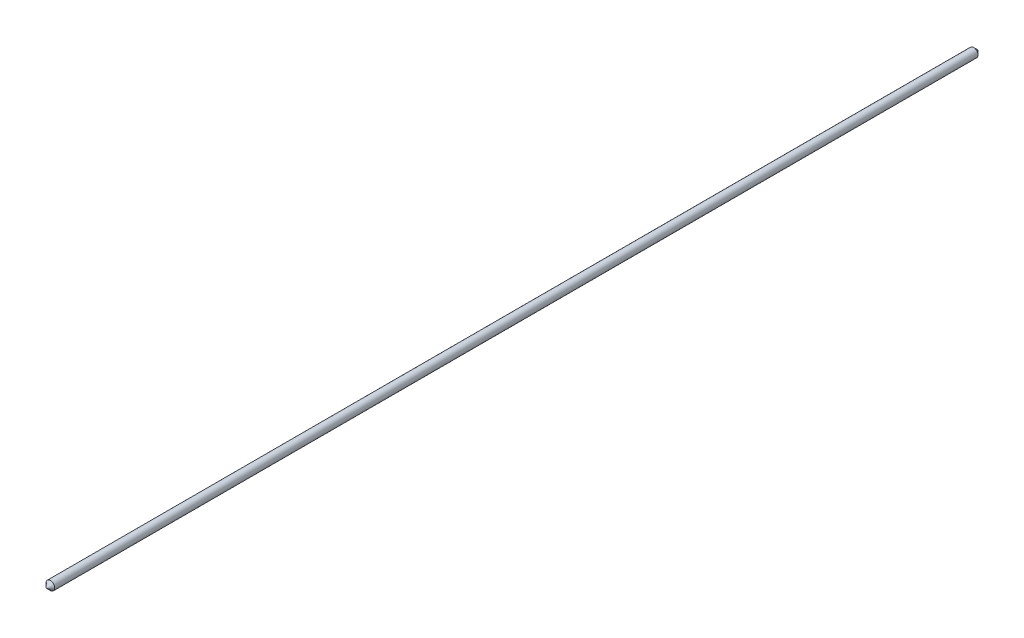
ISO-10303-21;
HEADER;
FILE_DESCRIPTION(('STEP AP214'),'2;1');
FILE_NAME('part.step','',(''),(''),'','','');
FILE_SCHEMA(('AUTOMOTIVE_DESIGN { 1 0 10303 214 1 1 1 1 }'));
ENDSEC;
DATA;
#1=APPLICATION_CONTEXT('core data for automotive mechanical design processes');
#2=APPLICATION_PROTOCOL_DEFINITION('international standard','automotive_design',2000,#1);
#3=PRODUCT_CONTEXT('',#1,'mechanical');
#4=PRODUCT('Part','Part','',(#3));
#5=PRODUCT_RELATED_PRODUCT_CATEGORY('part','',(#4));
#6=PRODUCT_DEFINITION_FORMATION('','',#4);
#7=PRODUCT_DEFINITION_CONTEXT('part definition',#1,'design');
#8=PRODUCT_DEFINITION('design','',#6,#7);
#9=PRODUCT_DEFINITION_SHAPE('','',#8);
#10=(LENGTH_UNIT() NAMED_UNIT(*) SI_UNIT(.MILLI.,.METRE.));
#11=(NAMED_UNIT(*) PLANE_ANGLE_UNIT() SI_UNIT($,.RADIAN.));
#12=(NAMED_UNIT(*) SI_UNIT($,.STERADIAN.) SOLID_ANGLE_UNIT());
#13=UNCERTAINTY_MEASURE_WITH_UNIT(LENGTH_MEASURE(1.E-05),#10,'distance_accuracy_value','');
#14=(GEOMETRIC_REPRESENTATION_CONTEXT(3) GLOBAL_UNCERTAINTY_ASSIGNED_CONTEXT((#13)) GLOBAL_UNIT_ASSIGNED_CONTEXT((#10,
#11,#12)) REPRESENTATION_CONTEXT('',''));
#15=CARTESIAN_POINT('',(0.,0.,0.));
#16=DIRECTION('',(0.,0.,1.));
#17=DIRECTION('',(1.,0.,0.));
#18=AXIS2_PLACEMENT_3D('',#15,#16,#17);
#19=CARTESIAN_POINT('',(0.,0.,42.3398511991857));
#20=DIRECTION('',(0.,0.,-1.));
#21=DIRECTION('',(-1.,0.,0.));
#22=AXIS2_PLACEMENT_3D('',#19,#20,#21);
#23=CONICAL_SURFACE('',#22,10.3954004658793,0.785398163397443);
#24=CARTESIAN_POINT('',(0.,0.,52.7352516650651));
#25=VERTEX_POINT('',#24);
#26=VERTEX_LOOP('',#25);
#27=FACE_BOUND('',#26,.T.);
#28=CARTESIAN_POINT('',(0.,0.,42.3398511991857));
#29=DIRECTION('',(0.,0.,1.));
#30=DIRECTION('',(1.,0.,0.));
#31=AXIS2_PLACEMENT_3D('',#28,#29,#30);
#32=CIRCLE('',#31,10.3954004658793);
#33=CARTESIAN_POINT('',(10.3954004658793,0.,42.3398511991857));
#34=VERTEX_POINT('',#33);
#35=EDGE_CURVE('E11',#34,#34,#32,.T.);
#36=ORIENTED_EDGE('',*,*,#35,.T.);
#37=EDGE_LOOP('',(#36));
#38=FACE_BOUND('',#37,.T.);
#39=ADVANCED_FACE('F39',(#27,#38),#23,.T.);
#40=CARTESIAN_POINT('',(0.,0.,42.3398511991857));
#41=DIRECTION('',(0.,0.,1.));
#42=DIRECTION('',(1.,0.,0.));
#43=AXIS2_PLACEMENT_3D('',#40,#41,#42);
#44=CYLINDRICAL_SURFACE('',#43,10.3954004658793);
#45=ORIENTED_EDGE('',*,*,#35,.F.);
#46=EDGE_LOOP('',(#45));
#47=FACE_BOUND('',#46,.T.);
#48=CARTESIAN_POINT('',(0.,0.,-2157.66014880081));
#49=DIRECTION('',(0.,0.,1.));
#50=DIRECTION('',(1.,0.,0.));
#51=AXIS2_PLACEMENT_3D('',#48,#49,#50);
#52=CIRCLE('',#51,10.3954004658793);
#53=CARTESIAN_POINT('',(10.3954004658793,0.,-2157.66014880081));
#54=VERTEX_POINT('',#53);
#55=EDGE_CURVE('E47',#54,#54,#52,.T.);
#56=ORIENTED_EDGE('',*,*,#55,.T.);
#57=EDGE_LOOP('',(#56));
#58=FACE_BOUND('',#57,.T.);
#59=ADVANCED_FACE('F55',(#47,#58),#44,.T.);
#60=CARTESIAN_POINT('',(0.,0.,-2168.05554926669));
#61=DIRECTION('',(0.,0.,1.));
#62=DIRECTION('',(1.,0.,0.));
#63=AXIS2_PLACEMENT_3D('',#60,#61,#62);
#64=CONICAL_SURFACE('',#63,0.,0.78539816339744);
#65=ORIENTED_EDGE('',*,*,#55,.F.);
#66=EDGE_LOOP('',(#65));
#67=FACE_BOUND('',#66,.T.);
#68=CARTESIAN_POINT('',(0.,0.,-2168.05554926669));
#69=VERTEX_POINT('',#68);
#70=VERTEX_LOOP('',#69);
#71=FACE_BOUND('',#70,.T.);
#72=ADVANCED_FACE('F53',(#67,#71),#64,.T.);
#73=CLOSED_SHELL('',(#39,#59,#72));
#74=MANIFOLD_SOLID_BREP('B2',#73);
#75=ADVANCED_BREP_SHAPE_REPRESENTATION('',(#18,#74),#14);
#76=SHAPE_DEFINITION_REPRESENTATION(#9,#75);
ENDSEC;
END-ISO-10303-21;
